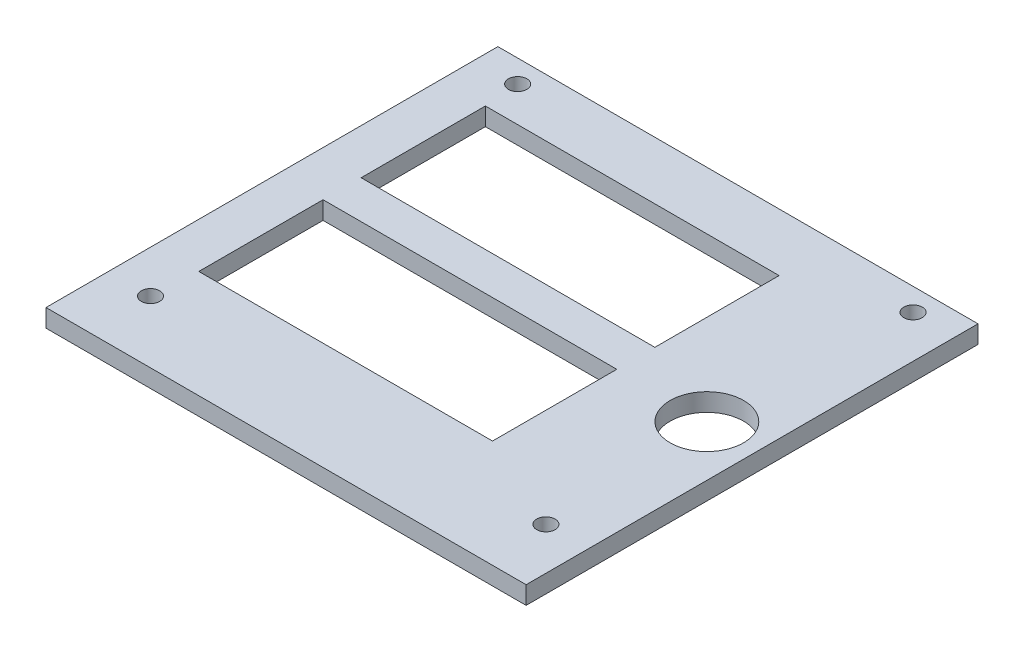
ISO-10303-21;
HEADER;
FILE_DESCRIPTION(('STEP AP214'),'2;1');
FILE_NAME('part.step','',(''),(''),'','','');
FILE_SCHEMA(('AUTOMOTIVE_DESIGN { 1 0 10303 214 1 1 1 1 }'));
ENDSEC;
DATA;
#1=APPLICATION_CONTEXT('core data for automotive mechanical design processes');
#2=APPLICATION_PROTOCOL_DEFINITION('international standard','automotive_design',2000,#1);
#3=PRODUCT_CONTEXT('',#1,'mechanical');
#4=PRODUCT('Part','Part','',(#3));
#5=PRODUCT_RELATED_PRODUCT_CATEGORY('part','',(#4));
#6=PRODUCT_DEFINITION_FORMATION('','',#4);
#7=PRODUCT_DEFINITION_CONTEXT('part definition',#1,'design');
#8=PRODUCT_DEFINITION('design','',#6,#7);
#9=PRODUCT_DEFINITION_SHAPE('','',#8);
#10=(LENGTH_UNIT() NAMED_UNIT(*) SI_UNIT(.MILLI.,.METRE.));
#11=(NAMED_UNIT(*) PLANE_ANGLE_UNIT() SI_UNIT($,.RADIAN.));
#12=(NAMED_UNIT(*) SI_UNIT($,.STERADIAN.) SOLID_ANGLE_UNIT());
#13=UNCERTAINTY_MEASURE_WITH_UNIT(LENGTH_MEASURE(1.E-05),#10,'distance_accuracy_value','');
#14=(GEOMETRIC_REPRESENTATION_CONTEXT(3) GLOBAL_UNCERTAINTY_ASSIGNED_CONTEXT((#13)) GLOBAL_UNIT_ASSIGNED_CONTEXT((#10,
#11,#12)) REPRESENTATION_CONTEXT('',''));
#15=CARTESIAN_POINT('',(0.,0.,0.));
#16=DIRECTION('',(0.,0.,1.));
#17=DIRECTION('',(1.,0.,0.));
#18=AXIS2_PLACEMENT_3D('',#15,#16,#17);
#19=CARTESIAN_POINT('',(0.,3.175,0.));
#20=DIRECTION('',(0.,1.,0.));
#21=DIRECTION('',(0.,0.,1.));
#22=AXIS2_PLACEMENT_3D('',#19,#20,#21);
#23=PLANE('',#22);
#24=CARTESIAN_POINT('',(77.5,3.175,69.));
#25=DIRECTION('',(0.,1.,0.));
#26=DIRECTION('',(0.,0.,1.));
#27=AXIS2_PLACEMENT_3D('',#24,#25,#26);
#28=CIRCLE('',#27,1.63195);
#29=CARTESIAN_POINT('',(77.5,3.175,70.63195));
#30=VERTEX_POINT('',#29);
#31=EDGE_CURVE('E189',#30,#30,#28,.T.);
#32=ORIENTED_EDGE('',*,*,#31,.F.);
#33=EDGE_LOOP('',(#32));
#34=FACE_BOUND('',#33,.T.);
#35=CARTESIAN_POINT('',(7.5,3.175,4.));
#36=DIRECTION('',(0.,1.,0.));
#37=DIRECTION('',(0.,0.,1.));
#38=AXIS2_PLACEMENT_3D('',#35,#36,#37);
#39=CIRCLE('',#38,1.63195);
#40=CARTESIAN_POINT('',(7.5,3.175,5.63195));
#41=VERTEX_POINT('',#40);
#42=EDGE_CURVE('E205',#41,#41,#39,.T.);
#43=ORIENTED_EDGE('',*,*,#42,.F.);
#44=EDGE_LOOP('',(#43));
#45=FACE_BOUND('',#44,.T.);
#46=DIRECTION('',(0.,0.,1.));
#47=VECTOR('',#46,1.);
#48=CARTESIAN_POINT('',(0.,3.175,0.));
#49=LINE('',#48,#47);
#50=CARTESIAN_POINT('',(0.,3.175,0.));
#51=VERTEX_POINT('',#50);
#52=CARTESIAN_POINT('',(0.,3.175,80.));
#53=VERTEX_POINT('',#52);
#54=EDGE_CURVE('E264',#51,#53,#49,.T.);
#55=ORIENTED_EDGE('',*,*,#54,.T.);
#56=DIRECTION('',(1.,0.,0.));
#57=VECTOR('',#56,1.);
#58=CARTESIAN_POINT('',(0.,3.175,80.));
#59=LINE('',#58,#57);
#60=CARTESIAN_POINT('',(85.,3.175,80.));
#61=VERTEX_POINT('',#60);
#62=EDGE_CURVE('E268',#53,#61,#59,.T.);
#63=ORIENTED_EDGE('',*,*,#62,.T.);
#64=DIRECTION('',(0.,0.,-1.));
#65=VECTOR('',#64,1.);
#66=CARTESIAN_POINT('',(85.,3.175,0.));
#67=LINE('',#66,#65);
#68=CARTESIAN_POINT('',(85.,3.175,0.));
#69=VERTEX_POINT('',#68);
#70=EDGE_CURVE('E272',#61,#69,#67,.T.);
#71=ORIENTED_EDGE('',*,*,#70,.T.);
#72=DIRECTION('',(-1.,0.,0.));
#73=VECTOR('',#72,1.);
#74=CARTESIAN_POINT('',(0.,3.175,0.));
#75=LINE('',#74,#73);
#76=EDGE_CURVE('E275',#69,#51,#75,.T.);
#77=ORIENTED_EDGE('',*,*,#76,.T.);
#78=EDGE_LOOP('',(#55,#63,#71,#77));
#79=FACE_BOUND('',#78,.T.);
#80=CARTESIAN_POINT('',(76.,3.175,39.));
#81=DIRECTION('',(0.,1.,0.));
#82=DIRECTION('',(0.,0.,1.));
#83=AXIS2_PLACEMENT_3D('',#80,#81,#82);
#84=CIRCLE('',#83,6.5);
#85=CARTESIAN_POINT('',(76.,3.175,45.5));
#86=VERTEX_POINT('',#85);
#87=EDGE_CURVE('E256',#86,#86,#84,.T.);
#88=ORIENTED_EDGE('',*,*,#87,.F.);
#89=EDGE_LOOP('',(#88));
#90=FACE_BOUND('',#89,.T.);
#91=DIRECTION('',(1.,0.,0.));
#92=VECTOR('',#91,1.);
#93=CARTESIAN_POINT('',(8.00000000000001,3.175,60.95));
#94=LINE('',#93,#92);
#95=CARTESIAN_POINT('',(8.00000000000001,3.175,60.95));
#96=VERTEX_POINT('',#95);
#97=CARTESIAN_POINT('',(60.,3.175,60.95));
#98=VERTEX_POINT('',#97);
#99=EDGE_CURVE('E216',#96,#98,#94,.T.);
#100=ORIENTED_EDGE('',*,*,#99,.F.);
#101=DIRECTION('',(0.,0.,1.));
#102=VECTOR('',#101,1.);
#103=CARTESIAN_POINT('',(8.,3.175,38.95));
#104=LINE('',#103,#102);
#105=CARTESIAN_POINT('',(8.,3.175,38.95));
#106=VERTEX_POINT('',#105);
#107=EDGE_CURVE('E213',#106,#96,#104,.T.);
#108=ORIENTED_EDGE('',*,*,#107,.F.);
#109=DIRECTION('',(-1.,0.,0.));
#110=VECTOR('',#109,1.);
#111=CARTESIAN_POINT('',(8.,3.175,38.95));
#112=LINE('',#111,#110);
#113=CARTESIAN_POINT('',(60.,3.175,38.95));
#114=VERTEX_POINT('',#113);
#115=EDGE_CURVE('E224',#114,#106,#112,.T.);
#116=ORIENTED_EDGE('',*,*,#115,.F.);
#117=DIRECTION('',(0.,0.,-1.));
#118=VECTOR('',#117,1.);
#119=CARTESIAN_POINT('',(60.,3.175,38.95));
#120=LINE('',#119,#118);
#121=EDGE_CURVE('E220',#98,#114,#120,.T.);
#122=ORIENTED_EDGE('',*,*,#121,.F.);
#123=EDGE_LOOP('',(#100,#108,#116,#122));
#124=FACE_BOUND('',#123,.T.);
#125=CARTESIAN_POINT('',(7.50000000000001,3.175,69.));
#126=DIRECTION('',(0.,1.,0.));
#127=DIRECTION('',(0.,0.,1.));
#128=AXIS2_PLACEMENT_3D('',#125,#126,#127);
#129=CIRCLE('',#128,1.63195);
#130=CARTESIAN_POINT('',(7.50000000000001,3.175,70.63195));
#131=VERTEX_POINT('',#130);
#132=EDGE_CURVE('E197',#131,#131,#129,.T.);
#133=ORIENTED_EDGE('',*,*,#132,.F.);
#134=EDGE_LOOP('',(#133));
#135=FACE_BOUND('',#134,.T.);
#136=CARTESIAN_POINT('',(77.5,3.175,4.));
#137=DIRECTION('',(0.,1.,0.));
#138=DIRECTION('',(0.,0.,1.));
#139=AXIS2_PLACEMENT_3D('',#136,#137,#138);
#140=CIRCLE('',#139,1.63195);
#141=CARTESIAN_POINT('',(77.5,3.175,5.63195));
#142=VERTEX_POINT('',#141);
#143=EDGE_CURVE('E181',#142,#142,#140,.T.);
#144=ORIENTED_EDGE('',*,*,#143,.F.);
#145=EDGE_LOOP('',(#144));
#146=FACE_BOUND('',#145,.T.);
#147=DIRECTION('',(1.,0.,0.));
#148=VECTOR('',#147,1.);
#149=CARTESIAN_POINT('',(8.00000000000001,3.175,32.21));
#150=LINE('',#149,#148);
#151=CARTESIAN_POINT('',(8.00000000000001,3.175,32.21));
#152=VERTEX_POINT('',#151);
#153=CARTESIAN_POINT('',(60.,3.175,32.21));
#154=VERTEX_POINT('',#153);
#155=EDGE_CURVE('E142',#152,#154,#150,.T.);
#156=ORIENTED_EDGE('',*,*,#155,.F.);
#157=DIRECTION('',(0.,0.,1.));
#158=VECTOR('',#157,1.);
#159=CARTESIAN_POINT('',(8.,3.175,10.21));
#160=LINE('',#159,#158);
#161=CARTESIAN_POINT('',(8.,3.175,10.21));
#162=VERTEX_POINT('',#161);
#163=EDGE_CURVE('E133',#162,#152,#160,.T.);
#164=ORIENTED_EDGE('',*,*,#163,.F.);
#165=DIRECTION('',(-1.,0.,0.));
#166=VECTOR('',#165,1.);
#167=CARTESIAN_POINT('',(8.,3.175,10.21));
#168=LINE('',#167,#166);
#169=CARTESIAN_POINT('',(60.,3.175,10.21));
#170=VERTEX_POINT('',#169);
#171=EDGE_CURVE('E159',#170,#162,#168,.T.);
#172=ORIENTED_EDGE('',*,*,#171,.F.);
#173=DIRECTION('',(0.,0.,-1.));
#174=VECTOR('',#173,1.);
#175=CARTESIAN_POINT('',(60.,3.175,10.21));
#176=LINE('',#175,#174);
#177=EDGE_CURVE('E155',#154,#170,#176,.T.);
#178=ORIENTED_EDGE('',*,*,#177,.F.);
#179=EDGE_LOOP('',(#156,#164,#172,#178));
#180=FACE_BOUND('',#179,.T.);
#181=ADVANCED_FACE('F43',(#34,#45,#79,#90,#124,#135,#146,#180),#23,.T.);
#182=CARTESIAN_POINT('',(0.,0.,0.));
#183=DIRECTION('',(0.,1.,0.));
#184=DIRECTION('',(0.,0.,1.));
#185=AXIS2_PLACEMENT_3D('',#182,#183,#184);
#186=PLANE('',#185);
#187=CARTESIAN_POINT('',(77.5,0.,4.));
#188=DIRECTION('',(0.,1.,0.));
#189=DIRECTION('',(0.,0.,1.));
#190=AXIS2_PLACEMENT_3D('',#187,#188,#189);
#191=CIRCLE('',#190,1.63195);
#192=CARTESIAN_POINT('',(77.5,0.,5.63195));
#193=VERTEX_POINT('',#192);
#194=EDGE_CURVE('E151',#193,#193,#191,.T.);
#195=ORIENTED_EDGE('',*,*,#194,.T.);
#196=EDGE_LOOP('',(#195));
#197=FACE_BOUND('',#196,.T.);
#198=CARTESIAN_POINT('',(77.5,0.,69.));
#199=DIRECTION('',(0.,1.,0.));
#200=DIRECTION('',(0.,0.,1.));
#201=AXIS2_PLACEMENT_3D('',#198,#199,#200);
#202=CIRCLE('',#201,1.63195);
#203=CARTESIAN_POINT('',(77.5,0.,70.63195));
#204=VERTEX_POINT('',#203);
#205=EDGE_CURVE('E185',#204,#204,#202,.T.);
#206=ORIENTED_EDGE('',*,*,#205,.T.);
#207=EDGE_LOOP('',(#206));
#208=FACE_BOUND('',#207,.T.);
#209=CARTESIAN_POINT('',(7.50000000000001,0.,69.));
#210=DIRECTION('',(0.,1.,0.));
#211=DIRECTION('',(0.,0.,1.));
#212=AXIS2_PLACEMENT_3D('',#209,#210,#211);
#213=CIRCLE('',#212,1.63195);
#214=CARTESIAN_POINT('',(7.50000000000001,0.,70.63195));
#215=VERTEX_POINT('',#214);
#216=EDGE_CURVE('E193',#215,#215,#213,.T.);
#217=ORIENTED_EDGE('',*,*,#216,.T.);
#218=EDGE_LOOP('',(#217));
#219=FACE_BOUND('',#218,.T.);
#220=CARTESIAN_POINT('',(7.5,0.,4.));
#221=DIRECTION('',(0.,1.,0.));
#222=DIRECTION('',(0.,0.,1.));
#223=AXIS2_PLACEMENT_3D('',#220,#221,#222);
#224=CIRCLE('',#223,1.63195);
#225=CARTESIAN_POINT('',(7.5,0.,5.63195));
#226=VERTEX_POINT('',#225);
#227=EDGE_CURVE('E201',#226,#226,#224,.T.);
#228=ORIENTED_EDGE('',*,*,#227,.T.);
#229=EDGE_LOOP('',(#228));
#230=FACE_BOUND('',#229,.T.);
#231=DIRECTION('',(0.,0.,1.));
#232=VECTOR('',#231,1.);
#233=CARTESIAN_POINT('',(8.,0.,38.95));
#234=LINE('',#233,#232);
#235=CARTESIAN_POINT('',(8.,0.,38.95));
#236=VERTEX_POINT('',#235);
#237=CARTESIAN_POINT('',(8.00000000000001,0.,60.95));
#238=VERTEX_POINT('',#237);
#239=EDGE_CURVE('E209',#236,#238,#234,.T.);
#240=ORIENTED_EDGE('',*,*,#239,.T.);
#241=DIRECTION('',(1.,0.,0.));
#242=VECTOR('',#241,1.);
#243=CARTESIAN_POINT('',(8.00000000000001,0.,60.95));
#244=LINE('',#243,#242);
#245=CARTESIAN_POINT('',(60.,0.,60.95));
#246=VERTEX_POINT('',#245);
#247=EDGE_CURVE('E231',#238,#246,#244,.T.);
#248=ORIENTED_EDGE('',*,*,#247,.T.);
#249=DIRECTION('',(0.,0.,-1.));
#250=VECTOR('',#249,1.);
#251=CARTESIAN_POINT('',(60.,0.,38.95));
#252=LINE('',#251,#250);
#253=CARTESIAN_POINT('',(60.,0.,38.95));
#254=VERTEX_POINT('',#253);
#255=EDGE_CURVE('E235',#246,#254,#252,.T.);
#256=ORIENTED_EDGE('',*,*,#255,.T.);
#257=DIRECTION('',(-1.,0.,0.));
#258=VECTOR('',#257,1.);
#259=CARTESIAN_POINT('',(8.,0.,38.95));
#260=LINE('',#259,#258);
#261=EDGE_CURVE('E217',#254,#236,#260,.T.);
#262=ORIENTED_EDGE('',*,*,#261,.T.);
#263=EDGE_LOOP('',(#240,#248,#256,#262));
#264=FACE_BOUND('',#263,.T.);
#265=DIRECTION('',(0.,0.,1.));
#266=VECTOR('',#265,1.);
#267=CARTESIAN_POINT('',(0.,0.,0.));
#268=LINE('',#267,#266);
#269=CARTESIAN_POINT('',(0.,0.,0.));
#270=VERTEX_POINT('',#269);
#271=CARTESIAN_POINT('',(0.,0.,80.));
#272=VERTEX_POINT('',#271);
#273=EDGE_CURVE('E260',#270,#272,#268,.T.);
#274=ORIENTED_EDGE('',*,*,#273,.F.);
#275=DIRECTION('',(-1.,0.,0.));
#276=VECTOR('',#275,1.);
#277=CARTESIAN_POINT('',(0.,0.,0.));
#278=LINE('',#277,#276);
#279=CARTESIAN_POINT('',(85.,0.,0.));
#280=VERTEX_POINT('',#279);
#281=EDGE_CURVE('E269',#280,#270,#278,.T.);
#282=ORIENTED_EDGE('',*,*,#281,.F.);
#283=DIRECTION('',(0.,0.,-1.));
#284=VECTOR('',#283,1.);
#285=CARTESIAN_POINT('',(85.,0.,0.));
#286=LINE('',#285,#284);
#287=CARTESIAN_POINT('',(85.,0.,80.));
#288=VERTEX_POINT('',#287);
#289=EDGE_CURVE('E285',#288,#280,#286,.T.);
#290=ORIENTED_EDGE('',*,*,#289,.F.);
#291=DIRECTION('',(1.,0.,0.));
#292=VECTOR('',#291,1.);
#293=CARTESIAN_POINT('',(0.,0.,80.));
#294=LINE('',#293,#292);
#295=EDGE_CURVE('E282',#272,#288,#294,.T.);
#296=ORIENTED_EDGE('',*,*,#295,.F.);
#297=EDGE_LOOP('',(#274,#282,#290,#296));
#298=FACE_BOUND('',#297,.T.);
#299=CARTESIAN_POINT('',(76.,0.,39.));
#300=DIRECTION('',(0.,1.,0.));
#301=DIRECTION('',(0.,0.,1.));
#302=AXIS2_PLACEMENT_3D('',#299,#300,#301);
#303=CIRCLE('',#302,6.5);
#304=CARTESIAN_POINT('',(76.,0.,45.5));
#305=VERTEX_POINT('',#304);
#306=EDGE_CURVE('E255',#305,#305,#303,.T.);
#307=ORIENTED_EDGE('',*,*,#306,.T.);
#308=EDGE_LOOP('',(#307));
#309=FACE_BOUND('',#308,.T.);
#310=DIRECTION('',(0.,0.,1.));
#311=VECTOR('',#310,1.);
#312=CARTESIAN_POINT('',(8.,0.,10.21));
#313=LINE('',#312,#311);
#314=CARTESIAN_POINT('',(8.,0.,10.21));
#315=VERTEX_POINT('',#314);
#316=CARTESIAN_POINT('',(8.00000000000001,0.,32.21));
#317=VERTEX_POINT('',#316);
#318=EDGE_CURVE('E67',#315,#317,#313,.T.);
#319=ORIENTED_EDGE('',*,*,#318,.T.);
#320=DIRECTION('',(1.,0.,0.));
#321=VECTOR('',#320,1.);
#322=CARTESIAN_POINT('',(8.00000000000001,0.,32.21));
#323=LINE('',#322,#321);
#324=CARTESIAN_POINT('',(60.,0.,32.21));
#325=VERTEX_POINT('',#324);
#326=EDGE_CURVE('E149',#317,#325,#323,.T.);
#327=ORIENTED_EDGE('',*,*,#326,.T.);
#328=DIRECTION('',(0.,0.,-1.));
#329=VECTOR('',#328,1.);
#330=CARTESIAN_POINT('',(60.,0.,10.21));
#331=LINE('',#330,#329);
#332=CARTESIAN_POINT('',(60.,0.,10.21));
#333=VERTEX_POINT('',#332);
#334=EDGE_CURVE('E168',#325,#333,#331,.T.);
#335=ORIENTED_EDGE('',*,*,#334,.T.);
#336=DIRECTION('',(-1.,0.,0.));
#337=VECTOR('',#336,1.);
#338=CARTESIAN_POINT('',(8.,0.,10.21));
#339=LINE('',#338,#337);
#340=EDGE_CURVE('E143',#333,#315,#339,.T.);
#341=ORIENTED_EDGE('',*,*,#340,.T.);
#342=EDGE_LOOP('',(#319,#327,#335,#341));
#343=FACE_BOUND('',#342,.T.);
#344=ADVANCED_FACE('F308',(#197,#208,#219,#230,#264,#298,#309,#343),#186,.F.);
#345=CARTESIAN_POINT('',(0.,3.175,0.));
#346=DIRECTION('',(1.,0.,0.));
#347=DIRECTION('',(0.,0.,-1.));
#348=AXIS2_PLACEMENT_3D('',#345,#346,#347);
#349=PLANE('',#348);
#350=ORIENTED_EDGE('',*,*,#273,.T.);
#351=DIRECTION('',(0.,-1.,0.));
#352=VECTOR('',#351,1.);
#353=CARTESIAN_POINT('',(0.,3.175,80.));
#354=LINE('',#353,#352);
#355=EDGE_CURVE('E11',#53,#272,#354,.T.);
#356=ORIENTED_EDGE('',*,*,#355,.F.);
#357=ORIENTED_EDGE('',*,*,#54,.F.);
#358=DIRECTION('',(0.,-1.,0.));
#359=VECTOR('',#358,1.);
#360=CARTESIAN_POINT('',(0.,3.175,0.));
#361=LINE('',#360,#359);
#362=EDGE_CURVE('E278',#51,#270,#361,.T.);
#363=ORIENTED_EDGE('',*,*,#362,.T.);
#364=EDGE_LOOP('',(#350,#356,#357,#363));
#365=FACE_BOUND('',#364,.T.);
#366=ADVANCED_FACE('F45',(#365),#349,.F.);
#367=CARTESIAN_POINT('',(0.,3.175,80.));
#368=DIRECTION('',(0.,0.,-1.));
#369=DIRECTION('',(-1.,0.,0.));
#370=AXIS2_PLACEMENT_3D('',#367,#368,#369);
#371=PLANE('',#370);
#372=ORIENTED_EDGE('',*,*,#295,.T.);
#373=DIRECTION('',(0.,-1.,0.));
#374=VECTOR('',#373,1.);
#375=CARTESIAN_POINT('',(85.,3.175,80.));
#376=LINE('',#375,#374);
#377=EDGE_CURVE('E52',#61,#288,#376,.T.);
#378=ORIENTED_EDGE('',*,*,#377,.F.);
#379=ORIENTED_EDGE('',*,*,#62,.F.);
#380=ORIENTED_EDGE('',*,*,#355,.T.);
#381=EDGE_LOOP('',(#372,#378,#379,#380));
#382=FACE_BOUND('',#381,.T.);
#383=ADVANCED_FACE('F319',(#382),#371,.F.);
#384=CARTESIAN_POINT('',(85.,3.175,0.));
#385=DIRECTION('',(-1.,0.,0.));
#386=DIRECTION('',(0.,0.,1.));
#387=AXIS2_PLACEMENT_3D('',#384,#385,#386);
#388=PLANE('',#387);
#389=ORIENTED_EDGE('',*,*,#289,.T.);
#390=DIRECTION('',(0.,-1.,0.));
#391=VECTOR('',#390,1.);
#392=CARTESIAN_POINT('',(85.,3.175,0.));
#393=LINE('',#392,#391);
#394=EDGE_CURVE('E293',#69,#280,#393,.T.);
#395=ORIENTED_EDGE('',*,*,#394,.F.);
#396=ORIENTED_EDGE('',*,*,#70,.F.);
#397=ORIENTED_EDGE('',*,*,#377,.T.);
#398=EDGE_LOOP('',(#389,#395,#396,#397));
#399=FACE_BOUND('',#398,.T.);
#400=ADVANCED_FACE('F302',(#399),#388,.F.);
#401=CARTESIAN_POINT('',(0.,3.175,0.));
#402=DIRECTION('',(0.,0.,1.));
#403=DIRECTION('',(1.,0.,0.));
#404=AXIS2_PLACEMENT_3D('',#401,#402,#403);
#405=PLANE('',#404);
#406=ORIENTED_EDGE('',*,*,#281,.T.);
#407=ORIENTED_EDGE('',*,*,#362,.F.);
#408=ORIENTED_EDGE('',*,*,#76,.F.);
#409=ORIENTED_EDGE('',*,*,#394,.T.);
#410=EDGE_LOOP('',(#406,#407,#408,#409));
#411=FACE_BOUND('',#410,.T.);
#412=ADVANCED_FACE('F312',(#411),#405,.F.);
#413=CARTESIAN_POINT('',(76.,3.175,39.));
#414=DIRECTION('',(0.,-1.,0.));
#415=DIRECTION('',(0.,0.,-1.));
#416=AXIS2_PLACEMENT_3D('',#413,#414,#415);
#417=CYLINDRICAL_SURFACE('',#416,6.5);
#418=ORIENTED_EDGE('',*,*,#87,.T.);
#419=EDGE_LOOP('',(#418));
#420=FACE_BOUND('',#419,.T.);
#421=ORIENTED_EDGE('',*,*,#306,.F.);
#422=EDGE_LOOP('',(#421));
#423=FACE_BOUND('',#422,.T.);
#424=ADVANCED_FACE('F337',(#420,#423),#417,.F.);
#425=CARTESIAN_POINT('',(8.,3.175,38.95));
#426=DIRECTION('',(1.,0.,0.));
#427=DIRECTION('',(0.,0.,-1.));
#428=AXIS2_PLACEMENT_3D('',#425,#426,#427);
#429=PLANE('',#428);
#430=ORIENTED_EDGE('',*,*,#239,.F.);
#431=DIRECTION('',(0.,-1.,0.));
#432=VECTOR('',#431,1.);
#433=CARTESIAN_POINT('',(8.,3.175,38.95));
#434=LINE('',#433,#432);
#435=EDGE_CURVE('E227',#106,#236,#434,.T.);
#436=ORIENTED_EDGE('',*,*,#435,.F.);
#437=ORIENTED_EDGE('',*,*,#107,.T.);
#438=DIRECTION('',(0.,-1.,0.));
#439=VECTOR('',#438,1.);
#440=CARTESIAN_POINT('',(8.00000000000001,3.175,60.95));
#441=LINE('',#440,#439);
#442=EDGE_CURVE('E251',#96,#238,#441,.T.);
#443=ORIENTED_EDGE('',*,*,#442,.T.);
#444=EDGE_LOOP('',(#430,#436,#437,#443));
#445=FACE_BOUND('',#444,.T.);
#446=ADVANCED_FACE('F344',(#445),#429,.T.);
#447=CARTESIAN_POINT('',(8.00000000000001,3.175,60.95));
#448=DIRECTION('',(0.,0.,-1.));
#449=DIRECTION('',(-1.,0.,0.));
#450=AXIS2_PLACEMENT_3D('',#447,#448,#449);
#451=PLANE('',#450);
#452=ORIENTED_EDGE('',*,*,#247,.F.);
#453=ORIENTED_EDGE('',*,*,#442,.F.);
#454=ORIENTED_EDGE('',*,*,#99,.T.);
#455=DIRECTION('',(0.,-1.,0.));
#456=VECTOR('',#455,1.);
#457=CARTESIAN_POINT('',(60.,3.175,60.95));
#458=LINE('',#457,#456);
#459=EDGE_CURVE('E248',#98,#246,#458,.T.);
#460=ORIENTED_EDGE('',*,*,#459,.T.);
#461=EDGE_LOOP('',(#452,#453,#454,#460));
#462=FACE_BOUND('',#461,.T.);
#463=ADVANCED_FACE('F349',(#462),#451,.T.);
#464=CARTESIAN_POINT('',(60.,3.175,38.95));
#465=DIRECTION('',(-1.,0.,0.));
#466=DIRECTION('',(0.,0.,1.));
#467=AXIS2_PLACEMENT_3D('',#464,#465,#466);
#468=PLANE('',#467);
#469=ORIENTED_EDGE('',*,*,#255,.F.);
#470=ORIENTED_EDGE('',*,*,#459,.F.);
#471=ORIENTED_EDGE('',*,*,#121,.T.);
#472=DIRECTION('',(0.,-1.,0.));
#473=VECTOR('',#472,1.);
#474=CARTESIAN_POINT('',(60.,3.175,38.95));
#475=LINE('',#474,#473);
#476=EDGE_CURVE('E245',#114,#254,#475,.T.);
#477=ORIENTED_EDGE('',*,*,#476,.T.);
#478=EDGE_LOOP('',(#469,#470,#471,#477));
#479=FACE_BOUND('',#478,.T.);
#480=ADVANCED_FACE('F389',(#479),#468,.T.);
#481=CARTESIAN_POINT('',(8.,3.175,38.95));
#482=DIRECTION('',(0.,0.,1.));
#483=DIRECTION('',(1.,0.,0.));
#484=AXIS2_PLACEMENT_3D('',#481,#482,#483);
#485=PLANE('',#484);
#486=ORIENTED_EDGE('',*,*,#261,.F.);
#487=ORIENTED_EDGE('',*,*,#476,.F.);
#488=ORIENTED_EDGE('',*,*,#115,.T.);
#489=ORIENTED_EDGE('',*,*,#435,.T.);
#490=EDGE_LOOP('',(#486,#487,#488,#489));
#491=FACE_BOUND('',#490,.T.);
#492=ADVANCED_FACE('F385',(#491),#485,.T.);
#493=CARTESIAN_POINT('',(7.5,3.175,4.));
#494=DIRECTION('',(0.,-1.,0.));
#495=DIRECTION('',(0.,0.,-1.));
#496=AXIS2_PLACEMENT_3D('',#493,#494,#495);
#497=CYLINDRICAL_SURFACE('',#496,1.63195);
#498=ORIENTED_EDGE('',*,*,#42,.T.);
#499=EDGE_LOOP('',(#498));
#500=FACE_BOUND('',#499,.T.);
#501=ORIENTED_EDGE('',*,*,#227,.F.);
#502=EDGE_LOOP('',(#501));
#503=FACE_BOUND('',#502,.T.);
#504=ADVANCED_FACE('F381',(#500,#503),#497,.F.);
#505=CARTESIAN_POINT('',(7.50000000000001,3.175,69.));
#506=DIRECTION('',(0.,-1.,0.));
#507=DIRECTION('',(0.,0.,-1.));
#508=AXIS2_PLACEMENT_3D('',#505,#506,#507);
#509=CYLINDRICAL_SURFACE('',#508,1.63195);
#510=ORIENTED_EDGE('',*,*,#132,.T.);
#511=EDGE_LOOP('',(#510));
#512=FACE_BOUND('',#511,.T.);
#513=ORIENTED_EDGE('',*,*,#216,.F.);
#514=EDGE_LOOP('',(#513));
#515=FACE_BOUND('',#514,.T.);
#516=ADVANCED_FACE('F377',(#512,#515),#509,.F.);
#517=CARTESIAN_POINT('',(77.5,3.175,69.));
#518=DIRECTION('',(0.,-1.,0.));
#519=DIRECTION('',(0.,0.,-1.));
#520=AXIS2_PLACEMENT_3D('',#517,#518,#519);
#521=CYLINDRICAL_SURFACE('',#520,1.63195);
#522=ORIENTED_EDGE('',*,*,#31,.T.);
#523=EDGE_LOOP('',(#522));
#524=FACE_BOUND('',#523,.T.);
#525=ORIENTED_EDGE('',*,*,#205,.F.);
#526=EDGE_LOOP('',(#525));
#527=FACE_BOUND('',#526,.T.);
#528=ADVANCED_FACE('F373',(#524,#527),#521,.F.);
#529=CARTESIAN_POINT('',(77.5,3.175,4.));
#530=DIRECTION('',(0.,-1.,0.));
#531=DIRECTION('',(0.,0.,-1.));
#532=AXIS2_PLACEMENT_3D('',#529,#530,#531);
#533=CYLINDRICAL_SURFACE('',#532,1.63195);
#534=ORIENTED_EDGE('',*,*,#143,.T.);
#535=EDGE_LOOP('',(#534));
#536=FACE_BOUND('',#535,.T.);
#537=ORIENTED_EDGE('',*,*,#194,.F.);
#538=EDGE_LOOP('',(#537));
#539=FACE_BOUND('',#538,.T.);
#540=ADVANCED_FACE('F370',(#536,#539),#533,.F.);
#541=CARTESIAN_POINT('',(8.,3.175,10.21));
#542=DIRECTION('',(1.,0.,0.));
#543=DIRECTION('',(0.,0.,-1.));
#544=AXIS2_PLACEMENT_3D('',#541,#542,#543);
#545=PLANE('',#544);
#546=ORIENTED_EDGE('',*,*,#318,.F.);
#547=DIRECTION('',(0.,-1.,0.));
#548=VECTOR('',#547,1.);
#549=CARTESIAN_POINT('',(8.,3.175,10.21));
#550=LINE('',#549,#548);
#551=EDGE_CURVE('E137',#162,#315,#550,.T.);
#552=ORIENTED_EDGE('',*,*,#551,.F.);
#553=ORIENTED_EDGE('',*,*,#163,.T.);
#554=DIRECTION('',(0.,-1.,0.));
#555=VECTOR('',#554,1.);
#556=CARTESIAN_POINT('',(8.00000000000001,3.175,32.21));
#557=LINE('',#556,#555);
#558=EDGE_CURVE('E136',#152,#317,#557,.T.);
#559=ORIENTED_EDGE('',*,*,#558,.T.);
#560=EDGE_LOOP('',(#546,#552,#553,#559));
#561=FACE_BOUND('',#560,.T.);
#562=ADVANCED_FACE('F135',(#561),#545,.T.);
#563=CARTESIAN_POINT('',(8.00000000000001,3.175,32.21));
#564=DIRECTION('',(0.,0.,-1.));
#565=DIRECTION('',(-1.,0.,0.));
#566=AXIS2_PLACEMENT_3D('',#563,#564,#565);
#567=PLANE('',#566);
#568=ORIENTED_EDGE('',*,*,#326,.F.);
#569=ORIENTED_EDGE('',*,*,#558,.F.);
#570=ORIENTED_EDGE('',*,*,#155,.T.);
#571=DIRECTION('',(0.,-1.,0.));
#572=VECTOR('',#571,1.);
#573=CARTESIAN_POINT('',(60.,3.175,32.21));
#574=LINE('',#573,#572);
#575=EDGE_CURVE('E152',#154,#325,#574,.T.);
#576=ORIENTED_EDGE('',*,*,#575,.T.);
#577=EDGE_LOOP('',(#568,#569,#570,#576));
#578=FACE_BOUND('',#577,.T.);
#579=ADVANCED_FACE('F146',(#578),#567,.T.);
#580=CARTESIAN_POINT('',(60.,3.175,10.21));
#581=DIRECTION('',(-1.,0.,0.));
#582=DIRECTION('',(0.,0.,1.));
#583=AXIS2_PLACEMENT_3D('',#580,#581,#582);
#584=PLANE('',#583);
#585=ORIENTED_EDGE('',*,*,#334,.F.);
#586=ORIENTED_EDGE('',*,*,#575,.F.);
#587=ORIENTED_EDGE('',*,*,#177,.T.);
#588=DIRECTION('',(0.,-1.,0.));
#589=VECTOR('',#588,1.);
#590=CARTESIAN_POINT('',(60.,3.175,10.21));
#591=LINE('',#590,#589);
#592=EDGE_CURVE('E59',#170,#333,#591,.T.);
#593=ORIENTED_EDGE('',*,*,#592,.T.);
#594=EDGE_LOOP('',(#585,#586,#587,#593));
#595=FACE_BOUND('',#594,.T.);
#596=ADVANCED_FACE('F358',(#595),#584,.T.);
#597=CARTESIAN_POINT('',(8.,3.175,10.21));
#598=DIRECTION('',(0.,0.,1.));
#599=DIRECTION('',(1.,0.,0.));
#600=AXIS2_PLACEMENT_3D('',#597,#598,#599);
#601=PLANE('',#600);
#602=ORIENTED_EDGE('',*,*,#340,.F.);
#603=ORIENTED_EDGE('',*,*,#592,.F.);
#604=ORIENTED_EDGE('',*,*,#171,.T.);
#605=ORIENTED_EDGE('',*,*,#551,.T.);
#606=EDGE_LOOP('',(#602,#603,#604,#605));
#607=FACE_BOUND('',#606,.T.);
#608=ADVANCED_FACE('F356',(#607),#601,.T.);
#609=CLOSED_SHELL('',(#181,#344,#366,#383,#400,#412,#424,#446,#463,#480,#492,#504,#516,#528,
#540,#562,#579,#596,#608));
#610=MANIFOLD_SOLID_BREP('B2',#609);
#611=ADVANCED_BREP_SHAPE_REPRESENTATION('',(#18,#610),#14);
#612=SHAPE_DEFINITION_REPRESENTATION(#9,#611);
ENDSEC;
END-ISO-10303-21;
